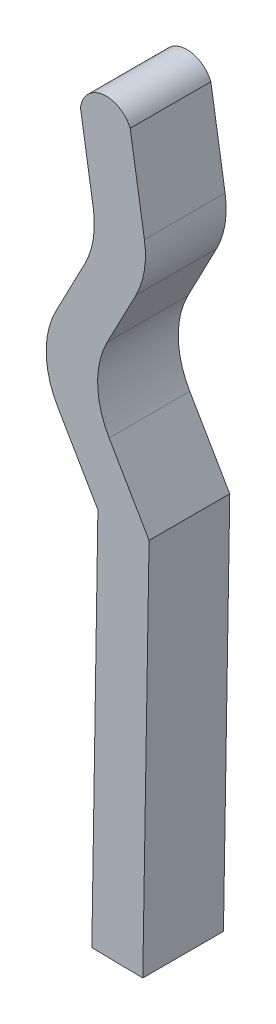
ISO-10303-21;
HEADER;
FILE_DESCRIPTION(('STEP AP214'),'2;1');
FILE_NAME('part.step','',(''),(''),'','','');
FILE_SCHEMA(('AUTOMOTIVE_DESIGN { 1 0 10303 214 1 1 1 1 }'));
ENDSEC;
DATA;
#1=APPLICATION_CONTEXT('core data for automotive mechanical design processes');
#2=APPLICATION_PROTOCOL_DEFINITION('international standard','automotive_design',2000,#1);
#3=PRODUCT_CONTEXT('',#1,'mechanical');
#4=PRODUCT('Part','Part','',(#3));
#5=PRODUCT_RELATED_PRODUCT_CATEGORY('part','',(#4));
#6=PRODUCT_DEFINITION_FORMATION('','',#4);
#7=PRODUCT_DEFINITION_CONTEXT('part definition',#1,'design');
#8=PRODUCT_DEFINITION('design','',#6,#7);
#9=PRODUCT_DEFINITION_SHAPE('','',#8);
#10=(LENGTH_UNIT() NAMED_UNIT(*) SI_UNIT(.MILLI.,.METRE.));
#11=(NAMED_UNIT(*) PLANE_ANGLE_UNIT() SI_UNIT($,.RADIAN.));
#12=(NAMED_UNIT(*) SI_UNIT($,.STERADIAN.) SOLID_ANGLE_UNIT());
#13=UNCERTAINTY_MEASURE_WITH_UNIT(LENGTH_MEASURE(1.E-05),#10,'distance_accuracy_value','');
#14=(GEOMETRIC_REPRESENTATION_CONTEXT(3) GLOBAL_UNCERTAINTY_ASSIGNED_CONTEXT((#13)) GLOBAL_UNIT_ASSIGNED_CONTEXT((#10,
#11,#12)) REPRESENTATION_CONTEXT('',''));
#15=CARTESIAN_POINT('',(0.,0.,0.));
#16=DIRECTION('',(0.,0.,1.));
#17=DIRECTION('',(1.,0.,0.));
#18=AXIS2_PLACEMENT_3D('',#15,#16,#17);
#19=CARTESIAN_POINT('',(-4.56938080544771,90.1852329953726,19.));
#20=DIRECTION('',(0.864439662143114,0.502736581634854,0.));
#21=DIRECTION('',(-0.502736581634854,0.864439662143114,0.));
#22=AXIS2_PLACEMENT_3D('',#19,#20,#21);
#23=PLANE('',#22);
#24=DIRECTION('',(0.502736581634854,-0.864439662143114,0.));
#25=VECTOR('',#24,1.);
#26=CARTESIAN_POINT('',(-4.56938080544771,90.1852329953726,0.));
#27=LINE('',#26,#25);
#28=CARTESIAN_POINT('',(-14.0325541857728,106.456860520643,0.));
#29=VERTEX_POINT('',#28);
#30=CARTESIAN_POINT('',(-4.56938080544771,90.1852329953726,0.));
#31=VERTEX_POINT('',#30);
#32=EDGE_CURVE('E165',#29,#31,#27,.T.);
#33=ORIENTED_EDGE('',*,*,#32,.T.);
#34=DIRECTION('',(0.,0.,-1.));
#35=VECTOR('',#34,1.);
#36=CARTESIAN_POINT('',(-4.56938080544771,90.1852329953726,19.));
#37=LINE('',#36,#35);
#38=CARTESIAN_POINT('',(-4.56938080544771,90.1852329953726,19.));
#39=VERTEX_POINT('',#38);
#40=EDGE_CURVE('E11',#39,#31,#37,.T.);
#41=ORIENTED_EDGE('',*,*,#40,.F.);
#42=DIRECTION('',(0.502736581634854,-0.864439662143114,0.));
#43=VECTOR('',#42,1.);
#44=CARTESIAN_POINT('',(-4.56938080544771,90.1852329953726,19.));
#45=LINE('',#44,#43);
#46=CARTESIAN_POINT('',(-14.0325541857728,106.456860520643,19.));
#47=VERTEX_POINT('',#46);
#48=EDGE_CURVE('E191',#47,#39,#45,.T.);
#49=ORIENTED_EDGE('',*,*,#48,.F.);
#50=DIRECTION('',(0.,0.,-1.));
#51=VECTOR('',#50,1.);
#52=CARTESIAN_POINT('',(-14.0325541857728,106.456860520643,19.));
#53=LINE('',#52,#51);
#54=EDGE_CURVE('E161',#47,#29,#53,.T.);
#55=ORIENTED_EDGE('',*,*,#54,.T.);
#56=EDGE_LOOP('',(#33,#41,#49,#55));
#57=FACE_BOUND('',#56,.T.);
#58=ADVANCED_FACE('F33',(#57),#23,.F.);
#59=CARTESIAN_POINT('',(-5.99677971324759,0.196552971949537,19.));
#60=DIRECTION('',(0.999874222482478,-0.0158599878644431,0.));
#61=DIRECTION('',(0.0158599878644431,0.999874222482478,0.));
#62=AXIS2_PLACEMENT_3D('',#59,#60,#61);
#63=PLANE('',#62);
#64=DIRECTION('',(-0.0158599878644431,-0.999874222482478,0.));
#65=VECTOR('',#64,1.);
#66=CARTESIAN_POINT('',(-5.99677971324759,0.196552971949537,0.));
#67=LINE('',#66,#65);
#68=CARTESIAN_POINT('',(-5.99677971324759,0.196552971949537,0.));
#69=VERTEX_POINT('',#68);
#70=EDGE_CURVE('E168',#31,#69,#67,.T.);
#71=ORIENTED_EDGE('',*,*,#70,.T.);
#72=DIRECTION('',(0.,0.,-1.));
#73=VECTOR('',#72,1.);
#74=CARTESIAN_POINT('',(-5.99677971324759,0.196552971949537,19.));
#75=LINE('',#74,#73);
#76=CARTESIAN_POINT('',(-5.99677971324759,0.196552971949537,19.));
#77=VERTEX_POINT('',#76);
#78=EDGE_CURVE('E41',#77,#69,#75,.T.);
#79=ORIENTED_EDGE('',*,*,#78,.F.);
#80=DIRECTION('',(-0.0158599878644431,-0.999874222482478,0.));
#81=VECTOR('',#80,1.);
#82=CARTESIAN_POINT('',(-5.99677971324759,0.196552971949537,19.));
#83=LINE('',#82,#81);
#84=EDGE_CURVE('E110',#39,#77,#83,.T.);
#85=ORIENTED_EDGE('',*,*,#84,.F.);
#86=ORIENTED_EDGE('',*,*,#40,.T.);
#87=EDGE_LOOP('',(#71,#79,#85,#86));
#88=FACE_BOUND('',#87,.T.);
#89=ADVANCED_FACE('F279',(#88),#63,.F.);
#90=CARTESIAN_POINT('',(6.,-2.20350539030523E-13,19.));
#91=DIRECTION('',(0.0163816125387095,0.999865812382157,0.));
#92=DIRECTION('',(-0.999865812382157,0.0163816125387095,0.));
#93=AXIS2_PLACEMENT_3D('',#90,#91,#92);
#94=PLANE('',#93);
#95=DIRECTION('',(0.999865812382157,-0.0163816125387095,0.));
#96=VECTOR('',#95,1.);
#97=CARTESIAN_POINT('',(6.,-2.20350539030523E-13,0.));
#98=LINE('',#97,#96);
#99=CARTESIAN_POINT('',(6.,-2.20350539030523E-13,0.));
#100=VERTEX_POINT('',#99);
#101=EDGE_CURVE('E170',#69,#100,#98,.T.);
#102=ORIENTED_EDGE('',*,*,#101,.T.);
#103=DIRECTION('',(0.,0.,-1.));
#104=VECTOR('',#103,1.);
#105=CARTESIAN_POINT('',(6.,-2.20350539030523E-13,19.));
#106=LINE('',#105,#104);
#107=CARTESIAN_POINT('',(6.,-2.20350539030523E-13,19.));
#108=VERTEX_POINT('',#107);
#109=EDGE_CURVE('E216',#108,#100,#106,.T.);
#110=ORIENTED_EDGE('',*,*,#109,.F.);
#111=DIRECTION('',(0.999865812382157,-0.0163816125387095,0.));
#112=VECTOR('',#111,1.);
#113=CARTESIAN_POINT('',(6.,-2.20350539030523E-13,19.));
#114=LINE('',#113,#112);
#115=EDGE_CURVE('E224',#77,#108,#114,.T.);
#116=ORIENTED_EDGE('',*,*,#115,.F.);
#117=ORIENTED_EDGE('',*,*,#78,.T.);
#118=EDGE_LOOP('',(#102,#110,#116,#117));
#119=FACE_BOUND('',#118,.T.);
#120=ADVANCED_FACE('F222',(#119),#94,.F.);
#121=CARTESIAN_POINT('',(6.,-2.20350539030523E-13,19.));
#122=DIRECTION('',(-0.999864104425258,0.0164855294690928,0.));
#123=DIRECTION('',(-0.0164855294690928,-0.999864104425258,0.));
#124=AXIS2_PLACEMENT_3D('',#121,#122,#123);
#125=PLANE('',#124);
#126=DIRECTION('',(0.0164855294690928,0.999864104425258,0.));
#127=VECTOR('',#126,1.);
#128=CARTESIAN_POINT('',(6.,-2.20350539030523E-13,0.));
#129=LINE('',#128,#127);
#130=CARTESIAN_POINT('',(7.48369765221835,89.987769398273,0.));
#131=VERTEX_POINT('',#130);
#132=EDGE_CURVE('E172',#100,#131,#129,.T.);
#133=ORIENTED_EDGE('',*,*,#132,.T.);
#134=DIRECTION('',(0.,0.,-1.));
#135=VECTOR('',#134,1.);
#136=CARTESIAN_POINT('',(7.48369765221835,89.987769398273,19.));
#137=LINE('',#136,#135);
#138=CARTESIAN_POINT('',(7.48369765221835,89.987769398273,19.));
#139=VERTEX_POINT('',#138);
#140=EDGE_CURVE('E213',#139,#131,#137,.T.);
#141=ORIENTED_EDGE('',*,*,#140,.F.);
#142=DIRECTION('',(0.0164855294690928,0.999864104425258,0.));
#143=VECTOR('',#142,1.);
#144=CARTESIAN_POINT('',(6.,-2.20350539030523E-13,19.));
#145=LINE('',#144,#143);
#146=EDGE_CURVE('E242',#108,#139,#145,.T.);
#147=ORIENTED_EDGE('',*,*,#146,.F.);
#148=ORIENTED_EDGE('',*,*,#109,.T.);
#149=EDGE_LOOP('',(#133,#141,#147,#148));
#150=FACE_BOUND('',#149,.T.);
#151=ADVANCED_FACE('F233',(#150),#125,.F.);
#152=CARTESIAN_POINT('',(7.48369765221835,89.987769398273,19.));
#153=DIRECTION('',(-0.864439662143114,-0.502736581634854,0.));
#154=DIRECTION('',(0.502736581634854,-0.864439662143114,0.));
#155=AXIS2_PLACEMENT_3D('',#152,#153,#154);
#156=PLANE('',#155);
#157=DIRECTION('',(-0.502736581634854,0.864439662143114,0.));
#158=VECTOR('',#157,1.);
#159=CARTESIAN_POINT('',(7.48369765221835,89.987769398273,0.));
#160=LINE('',#159,#158);
#161=CARTESIAN_POINT('',(-1.93034785426541,106.174923097256,0.));
#162=VERTEX_POINT('',#161);
#163=EDGE_CURVE('E174',#131,#162,#160,.T.);
#164=ORIENTED_EDGE('',*,*,#163,.T.);
#165=DIRECTION('',(0.,0.,-1.));
#166=VECTOR('',#165,1.);
#167=CARTESIAN_POINT('',(-1.93034785426541,106.174923097256,19.));
#168=LINE('',#167,#166);
#169=CARTESIAN_POINT('',(-1.93034785426541,106.174923097256,19.));
#170=VERTEX_POINT('',#169);
#171=EDGE_CURVE('E210',#170,#162,#168,.T.);
#172=ORIENTED_EDGE('',*,*,#171,.F.);
#173=DIRECTION('',(-0.502736581634854,0.864439662143114,0.));
#174=VECTOR('',#173,1.);
#175=CARTESIAN_POINT('',(7.48369765221835,89.987769398273,19.));
#176=LINE('',#175,#174);
#177=EDGE_CURVE('E239',#139,#170,#176,.T.);
#178=ORIENTED_EDGE('',*,*,#177,.F.);
#179=ORIENTED_EDGE('',*,*,#140,.T.);
#180=EDGE_LOOP('',(#164,#172,#178,#179));
#181=FACE_BOUND('',#180,.T.);
#182=ADVANCED_FACE('F237',(#181),#156,.F.);
#183=CARTESIAN_POINT('',(15.3584453885969,116.229654729953,19.));
#184=DIRECTION('',(0.,0.,-1.));
#185=DIRECTION('',(-1.,0.,0.));
#186=AXIS2_PLACEMENT_3D('',#183,#184,#185);
#187=CYLINDRICAL_SURFACE('',#186,20.);
#188=CARTESIAN_POINT('',(15.3584453885969,116.229654729953,0.));
#189=DIRECTION('',(0.,0.,-1.));
#190=DIRECTION('',(-1.,0.,0.));
#191=AXIS2_PLACEMENT_3D('',#188,#189,#190);
#192=CIRCLE('',#191,20.);
#193=CARTESIAN_POINT('',(-2.37317638365827,125.481118901947,0.));
#194=VERTEX_POINT('',#193);
#195=EDGE_CURVE('E176',#162,#194,#192,.T.);
#196=ORIENTED_EDGE('',*,*,#195,.T.);
#197=DIRECTION('',(0.,0.,-1.));
#198=VECTOR('',#197,1.);
#199=CARTESIAN_POINT('',(-2.37317638365827,125.481118901947,19.));
#200=LINE('',#199,#198);
#201=CARTESIAN_POINT('',(-2.37317638365827,125.481118901947,19.));
#202=VERTEX_POINT('',#201);
#203=EDGE_CURVE('E207',#202,#194,#200,.T.);
#204=ORIENTED_EDGE('',*,*,#203,.F.);
#205=CARTESIAN_POINT('',(15.3584453885969,116.229654729953,19.));
#206=DIRECTION('',(0.,0.,-1.));
#207=DIRECTION('',(-1.,0.,0.));
#208=AXIS2_PLACEMENT_3D('',#205,#206,#207);
#209=CIRCLE('',#208,20.);
#210=EDGE_CURVE('E241',#170,#202,#209,.T.);
#211=ORIENTED_EDGE('',*,*,#210,.F.);
#212=ORIENTED_EDGE('',*,*,#171,.T.);
#213=EDGE_LOOP('',(#196,#204,#211,#212));
#214=FACE_BOUND('',#213,.T.);
#215=ADVANCED_FACE('F292',(#214),#187,.F.);
#216=CARTESIAN_POINT('',(-2.37317638365828,125.481118901947,19.));
#217=DIRECTION('',(-0.886581088612757,0.462573208599697,0.));
#218=DIRECTION('',(-0.462573208599697,-0.886581088612757,0.));
#219=AXIS2_PLACEMENT_3D('',#216,#217,#218);
#220=PLANE('',#219);
#221=DIRECTION('',(0.462573208599697,0.886581088612757,0.));
#222=VECTOR('',#221,1.);
#223=CARTESIAN_POINT('',(-2.37317638365828,125.481118901947,0.));
#224=LINE('',#223,#222);
#225=CARTESIAN_POINT('',(4.36268880697785,138.391271462535,0.));
#226=VERTEX_POINT('',#225);
#227=EDGE_CURVE('E178',#194,#226,#224,.T.);
#228=ORIENTED_EDGE('',*,*,#227,.T.);
#229=DIRECTION('',(0.,0.,-1.));
#230=VECTOR('',#229,1.);
#231=CARTESIAN_POINT('',(4.36268880697785,138.391271462535,19.));
#232=LINE('',#231,#230);
#233=CARTESIAN_POINT('',(4.36268880697785,138.391271462535,19.));
#234=VERTEX_POINT('',#233);
#235=EDGE_CURVE('E204',#234,#226,#232,.T.);
#236=ORIENTED_EDGE('',*,*,#235,.F.);
#237=DIRECTION('',(0.462573208599697,0.886581088612757,0.));
#238=VECTOR('',#237,1.);
#239=CARTESIAN_POINT('',(-2.37317638365828,125.481118901947,19.));
#240=LINE('',#239,#238);
#241=EDGE_CURVE('E244',#202,#234,#240,.T.);
#242=ORIENTED_EDGE('',*,*,#241,.F.);
#243=ORIENTED_EDGE('',*,*,#203,.T.);
#244=EDGE_LOOP('',(#228,#236,#242,#243));
#245=FACE_BOUND('',#244,.T.);
#246=ADVANCED_FACE('F295',(#245),#220,.F.);
#247=CARTESIAN_POINT('',(-13.3689329652773,147.642735634529,19.));
#248=DIRECTION('',(0.,0.,-1.));
#249=DIRECTION('',(-1.,0.,0.));
#250=AXIS2_PLACEMENT_3D('',#247,#248,#249);
#251=CYLINDRICAL_SURFACE('',#250,20.);
#252=CARTESIAN_POINT('',(-13.3689329652773,147.642735634529,0.));
#253=DIRECTION('',(0.,0.,1.));
#254=DIRECTION('',(1.,0.,0.));
#255=AXIS2_PLACEMENT_3D('',#252,#253,#254);
#256=CIRCLE('',#255,20.);
#257=CARTESIAN_POINT('',(6.38281197541474,150.78416393991,0.));
#258=VERTEX_POINT('',#257);
#259=EDGE_CURVE('E180',#226,#258,#256,.T.);
#260=ORIENTED_EDGE('',*,*,#259,.T.);
#261=DIRECTION('',(0.,0.,-1.));
#262=VECTOR('',#261,1.);
#263=CARTESIAN_POINT('',(6.38281197541474,150.78416393991,19.));
#264=LINE('',#263,#262);
#265=CARTESIAN_POINT('',(6.38281197541474,150.78416393991,19.));
#266=VERTEX_POINT('',#265);
#267=EDGE_CURVE('E201',#266,#258,#264,.T.);
#268=ORIENTED_EDGE('',*,*,#267,.F.);
#269=CARTESIAN_POINT('',(-13.3689329652773,147.642735634529,19.));
#270=DIRECTION('',(0.,0.,1.));
#271=DIRECTION('',(1.,0.,0.));
#272=AXIS2_PLACEMENT_3D('',#269,#270,#271);
#273=CIRCLE('',#272,20.);
#274=EDGE_CURVE('E250',#234,#266,#273,.T.);
#275=ORIENTED_EDGE('',*,*,#274,.F.);
#276=ORIENTED_EDGE('',*,*,#235,.T.);
#277=EDGE_LOOP('',(#260,#268,#275,#276));
#278=FACE_BOUND('',#277,.T.);
#279=ADVANCED_FACE('F299',(#278),#251,.T.);
#280=CARTESIAN_POINT('',(6.38281197541473,150.78416393991,19.));
#281=DIRECTION('',(-0.987587247034603,-0.157071415269026,0.));
#282=DIRECTION('',(0.157071415269026,-0.987587247034603,0.));
#283=AXIS2_PLACEMENT_3D('',#280,#281,#282);
#284=PLANE('',#283);
#285=DIRECTION('',(-0.157071415269026,0.987587247034602,0.));
#286=VECTOR('',#285,1.);
#287=CARTESIAN_POINT('',(6.38281197541473,150.78416393991,0.));
#288=LINE('',#287,#286);
#289=CARTESIAN_POINT('',(3.03753801068546,171.817589402748,0.));
#290=VERTEX_POINT('',#289);
#291=EDGE_CURVE('E182',#258,#290,#288,.T.);
#292=ORIENTED_EDGE('',*,*,#291,.T.);
#293=DIRECTION('',(0.,0.,-1.));
#294=VECTOR('',#293,1.);
#295=CARTESIAN_POINT('',(3.03753801068546,171.817589402748,19.));
#296=LINE('',#295,#294);
#297=CARTESIAN_POINT('',(3.03753801068546,171.817589402748,19.));
#298=VERTEX_POINT('',#297);
#299=EDGE_CURVE('E198',#298,#290,#296,.T.);
#300=ORIENTED_EDGE('',*,*,#299,.F.);
#301=DIRECTION('',(-0.157071415269026,0.987587247034602,0.));
#302=VECTOR('',#301,1.);
#303=CARTESIAN_POINT('',(6.38281197541473,150.78416393991,19.));
#304=LINE('',#303,#302);
#305=EDGE_CURVE('E252',#266,#298,#304,.T.);
#306=ORIENTED_EDGE('',*,*,#305,.F.);
#307=ORIENTED_EDGE('',*,*,#267,.T.);
#308=EDGE_LOOP('',(#292,#300,#306,#307));
#309=FACE_BOUND('',#308,.T.);
#310=ADVANCED_FACE('F303',(#309),#284,.F.);
#311=CARTESIAN_POINT('',(-2.59672405150097,169.438533172839,19.));
#312=DIRECTION('',(0.,0.,-1.));
#313=DIRECTION('',(-1.,0.,0.));
#314=AXIS2_PLACEMENT_3D('',#311,#312,#313);
#315=CYLINDRICAL_SURFACE('',#314,6.11594780311769);
#316=CARTESIAN_POINT('',(-2.59672405150097,169.438533172839,0.));
#317=DIRECTION('',(0.,0.,1.));
#318=DIRECTION('',(-1.,0.,0.));
#319=AXIS2_PLACEMENT_3D('',#316,#317,#318);
#320=CIRCLE('',#319,6.11594780311769);
#321=CARTESIAN_POINT('',(-8.66978356173122,170.161558563584,0.));
#322=VERTEX_POINT('',#321);
#323=EDGE_CURVE('E184',#290,#322,#320,.T.);
#324=ORIENTED_EDGE('',*,*,#323,.T.);
#325=DIRECTION('',(0.,0.,-1.));
#326=VECTOR('',#325,1.);
#327=CARTESIAN_POINT('',(-8.66978356173122,170.161558563584,19.));
#328=LINE('',#327,#326);
#329=CARTESIAN_POINT('',(-8.66978356173122,170.161558563584,19.));
#330=VERTEX_POINT('',#329);
#331=EDGE_CURVE('E195',#330,#322,#328,.T.);
#332=ORIENTED_EDGE('',*,*,#331,.F.);
#333=CARTESIAN_POINT('',(-2.59672405150097,169.438533172839,19.));
#334=DIRECTION('',(0.,0.,1.));
#335=DIRECTION('',(-1.,0.,0.));
#336=AXIS2_PLACEMENT_3D('',#333,#334,#335);
#337=CIRCLE('',#336,6.11594780311769);
#338=EDGE_CURVE('E254',#298,#330,#337,.T.);
#339=ORIENTED_EDGE('',*,*,#338,.F.);
#340=ORIENTED_EDGE('',*,*,#299,.T.);
#341=EDGE_LOOP('',(#324,#332,#339,#340));
#342=FACE_BOUND('',#341,.T.);
#343=ADVANCED_FACE('F260',(#342),#315,.T.);
#344=CARTESIAN_POINT('',(-5.65298009163503,151.193392848812,19.));
#345=DIRECTION('',(0.987587247034603,0.157071415269027,0.));
#346=DIRECTION('',(-0.157071415269027,0.987587247034603,0.));
#347=AXIS2_PLACEMENT_3D('',#344,#345,#346);
#348=PLANE('',#347);
#349=DIRECTION('',(0.157071415269027,-0.987587247034602,0.));
#350=VECTOR('',#349,1.);
#351=CARTESIAN_POINT('',(-5.65298009163503,151.193392848812,0.));
#352=LINE('',#351,#350);
#353=CARTESIAN_POINT('',(-5.65298009163503,151.193392848812,0.));
#354=VERTEX_POINT('',#353);
#355=EDGE_CURVE('E186',#322,#354,#352,.T.);
#356=ORIENTED_EDGE('',*,*,#355,.T.);
#357=DIRECTION('',(0.,0.,-1.));
#358=VECTOR('',#357,1.);
#359=CARTESIAN_POINT('',(-5.65298009163503,151.193392848812,19.));
#360=LINE('',#359,#358);
#361=CARTESIAN_POINT('',(-5.65298009163503,151.193392848812,19.));
#362=VERTEX_POINT('',#361);
#363=EDGE_CURVE('E156',#362,#354,#360,.T.);
#364=ORIENTED_EDGE('',*,*,#363,.F.);
#365=DIRECTION('',(0.157071415269027,-0.987587247034602,0.));
#366=VECTOR('',#365,1.);
#367=CARTESIAN_POINT('',(-5.65298009163503,151.193392848812,19.));
#368=LINE('',#367,#366);
#369=EDGE_CURVE('E147',#330,#362,#368,.T.);
#370=ORIENTED_EDGE('',*,*,#369,.F.);
#371=ORIENTED_EDGE('',*,*,#331,.T.);
#372=EDGE_LOOP('',(#356,#364,#370,#371));
#373=FACE_BOUND('',#372,.T.);
#374=ADVANCED_FACE('F264',(#373),#348,.F.);
#375=CARTESIAN_POINT('',(-25.4047250323271,148.051964543431,19.));
#376=DIRECTION('',(0.,0.,-1.));
#377=DIRECTION('',(-1.,0.,0.));
#378=AXIS2_PLACEMENT_3D('',#375,#376,#377);
#379=CYLINDRICAL_SURFACE('',#378,20.);
#380=CARTESIAN_POINT('',(-25.4047250323271,148.051964543431,0.));
#381=DIRECTION('',(0.,0.,-1.));
#382=DIRECTION('',(1.,0.,0.));
#383=AXIS2_PLACEMENT_3D('',#380,#381,#382);
#384=CIRCLE('',#383,20.);
#385=CARTESIAN_POINT('',(-7.67310326007194,138.800500371437,0.));
#386=VERTEX_POINT('',#385);
#387=EDGE_CURVE('E155',#354,#386,#384,.T.);
#388=ORIENTED_EDGE('',*,*,#387,.T.);
#389=DIRECTION('',(0.,0.,-1.));
#390=VECTOR('',#389,1.);
#391=CARTESIAN_POINT('',(-7.67310326007194,138.800500371437,19.));
#392=LINE('',#391,#390);
#393=CARTESIAN_POINT('',(-7.67310326007194,138.800500371437,19.));
#394=VERTEX_POINT('',#393);
#395=EDGE_CURVE('E152',#394,#386,#392,.T.);
#396=ORIENTED_EDGE('',*,*,#395,.F.);
#397=CARTESIAN_POINT('',(-25.4047250323271,148.051964543431,19.));
#398=DIRECTION('',(0.,0.,-1.));
#399=DIRECTION('',(1.,0.,0.));
#400=AXIS2_PLACEMENT_3D('',#397,#398,#399);
#401=CIRCLE('',#400,20.);
#402=EDGE_CURVE('E141',#362,#394,#401,.T.);
#403=ORIENTED_EDGE('',*,*,#402,.F.);
#404=ORIENTED_EDGE('',*,*,#363,.T.);
#405=EDGE_LOOP('',(#388,#396,#403,#404));
#406=FACE_BOUND('',#405,.T.);
#407=ADVANCED_FACE('F153',(#406),#379,.F.);
#408=CARTESIAN_POINT('',(-14.4753827151656,125.763056325334,19.));
#409=DIRECTION('',(0.886581088612757,-0.462573208599697,0.));
#410=DIRECTION('',(0.462573208599697,0.886581088612757,0.));
#411=AXIS2_PLACEMENT_3D('',#408,#409,#410);
#412=PLANE('',#411);
#413=DIRECTION('',(-0.462573208599697,-0.886581088612757,0.));
#414=VECTOR('',#413,1.);
#415=CARTESIAN_POINT('',(-14.4753827151656,125.763056325334,0.));
#416=LINE('',#415,#414);
#417=CARTESIAN_POINT('',(-14.4753827151656,125.763056325334,0.));
#418=VERTEX_POINT('',#417);
#419=EDGE_CURVE('E96',#386,#418,#416,.T.);
#420=ORIENTED_EDGE('',*,*,#419,.T.);
#421=DIRECTION('',(0.,0.,-1.));
#422=VECTOR('',#421,1.);
#423=CARTESIAN_POINT('',(-14.4753827151656,125.763056325334,19.));
#424=LINE('',#423,#422);
#425=CARTESIAN_POINT('',(-14.4753827151656,125.763056325334,19.));
#426=VERTEX_POINT('',#425);
#427=EDGE_CURVE('E157',#426,#418,#424,.T.);
#428=ORIENTED_EDGE('',*,*,#427,.F.);
#429=DIRECTION('',(-0.462573208599697,-0.886581088612757,0.));
#430=VECTOR('',#429,1.);
#431=CARTESIAN_POINT('',(-14.4753827151656,125.763056325334,19.));
#432=LINE('',#431,#430);
#433=EDGE_CURVE('E145',#394,#426,#432,.T.);
#434=ORIENTED_EDGE('',*,*,#433,.F.);
#435=ORIENTED_EDGE('',*,*,#395,.T.);
#436=EDGE_LOOP('',(#420,#428,#434,#435));
#437=FACE_BOUND('',#436,.T.);
#438=ADVANCED_FACE('F159',(#437),#412,.F.);
#439=CARTESIAN_POINT('',(3.25623905708951,116.51159215334,19.));
#440=DIRECTION('',(0.,0.,-1.));
#441=DIRECTION('',(-1.,0.,0.));
#442=AXIS2_PLACEMENT_3D('',#439,#440,#441);
#443=CYLINDRICAL_SURFACE('',#442,20.);
#444=CARTESIAN_POINT('',(3.25623905708951,116.51159215334,0.));
#445=DIRECTION('',(0.,0.,1.));
#446=DIRECTION('',(1.,0.,0.));
#447=AXIS2_PLACEMENT_3D('',#444,#445,#446);
#448=CIRCLE('',#447,20.);
#449=EDGE_CURVE('E102',#418,#29,#448,.T.);
#450=ORIENTED_EDGE('',*,*,#449,.T.);
#451=ORIENTED_EDGE('',*,*,#54,.F.);
#452=CARTESIAN_POINT('',(3.25623905708951,116.51159215334,19.));
#453=DIRECTION('',(0.,0.,1.));
#454=DIRECTION('',(1.,0.,0.));
#455=AXIS2_PLACEMENT_3D('',#452,#453,#454);
#456=CIRCLE('',#455,20.);
#457=EDGE_CURVE('E49',#426,#47,#456,.T.);
#458=ORIENTED_EDGE('',*,*,#457,.F.);
#459=ORIENTED_EDGE('',*,*,#427,.T.);
#460=EDGE_LOOP('',(#450,#451,#458,#459));
#461=FACE_BOUND('',#460,.T.);
#462=ADVANCED_FACE('F268',(#461),#443,.T.);
#463=CARTESIAN_POINT('',(3.25623905708951,116.51159215334,19.));
#464=DIRECTION('',(0.,0.,1.));
#465=DIRECTION('',(1.,0.,0.));
#466=AXIS2_PLACEMENT_3D('',#463,#464,#465);
#467=PLANE('',#466);
#468=ORIENTED_EDGE('',*,*,#48,.T.);
#469=ORIENTED_EDGE('',*,*,#84,.T.);
#470=ORIENTED_EDGE('',*,*,#115,.T.);
#471=ORIENTED_EDGE('',*,*,#146,.T.);
#472=ORIENTED_EDGE('',*,*,#177,.T.);
#473=ORIENTED_EDGE('',*,*,#210,.T.);
#474=ORIENTED_EDGE('',*,*,#241,.T.);
#475=ORIENTED_EDGE('',*,*,#274,.T.);
#476=ORIENTED_EDGE('',*,*,#305,.T.);
#477=ORIENTED_EDGE('',*,*,#338,.T.);
#478=ORIENTED_EDGE('',*,*,#369,.T.);
#479=ORIENTED_EDGE('',*,*,#402,.T.);
#480=ORIENTED_EDGE('',*,*,#433,.T.);
#481=ORIENTED_EDGE('',*,*,#457,.T.);
#482=EDGE_LOOP('',(#468,#469,#470,#471,#472,#473,#474,#475,#476,#477,#478,#479,#480,#481));
#483=FACE_BOUND('',#482,.T.);
#484=ADVANCED_FACE('F143',(#483),#467,.T.);
#485=CARTESIAN_POINT('',(3.25623905708951,116.51159215334,0.));
#486=DIRECTION('',(0.,0.,1.));
#487=DIRECTION('',(1.,0.,0.));
#488=AXIS2_PLACEMENT_3D('',#485,#486,#487);
#489=PLANE('',#488);
#490=ORIENTED_EDGE('',*,*,#32,.F.);
#491=ORIENTED_EDGE('',*,*,#449,.F.);
#492=ORIENTED_EDGE('',*,*,#419,.F.);
#493=ORIENTED_EDGE('',*,*,#387,.F.);
#494=ORIENTED_EDGE('',*,*,#355,.F.);
#495=ORIENTED_EDGE('',*,*,#323,.F.);
#496=ORIENTED_EDGE('',*,*,#291,.F.);
#497=ORIENTED_EDGE('',*,*,#259,.F.);
#498=ORIENTED_EDGE('',*,*,#227,.F.);
#499=ORIENTED_EDGE('',*,*,#195,.F.);
#500=ORIENTED_EDGE('',*,*,#163,.F.);
#501=ORIENTED_EDGE('',*,*,#132,.F.);
#502=ORIENTED_EDGE('',*,*,#101,.F.);
#503=ORIENTED_EDGE('',*,*,#70,.F.);
#504=EDGE_LOOP('',(#490,#491,#492,#493,#494,#495,#496,#497,#498,#499,#500,#501,#502,#503));
#505=FACE_BOUND('',#504,.T.);
#506=ADVANCED_FACE('F228',(#505),#489,.F.);
#507=CLOSED_SHELL('',(#58,#89,#120,#151,#182,#215,#246,#279,#310,#343,#374,#407,#438,#462,#484,#506));
#508=MANIFOLD_SOLID_BREP('B2',#507);
#509=ADVANCED_BREP_SHAPE_REPRESENTATION('',(#18,#508),#14);
#510=SHAPE_DEFINITION_REPRESENTATION(#9,#509);
ENDSEC;
END-ISO-10303-21;
